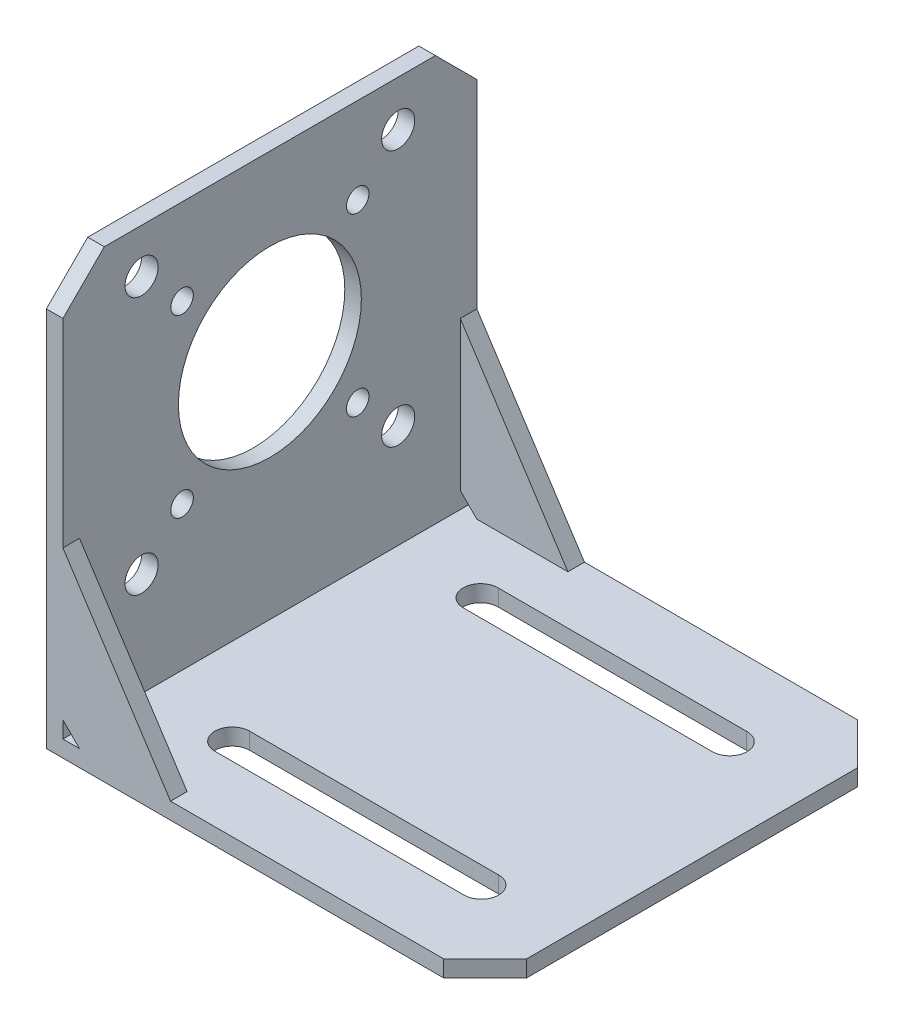
ISO-10303-21;
HEADER;
FILE_DESCRIPTION(('STEP AP214'),'2;1');
FILE_NAME('part.step','',(''),(''),'','','');
FILE_SCHEMA(('AUTOMOTIVE_DESIGN { 1 0 10303 214 1 1 1 1 }'));
ENDSEC;
DATA;
#1=APPLICATION_CONTEXT('core data for automotive mechanical design processes');
#2=APPLICATION_PROTOCOL_DEFINITION('international standard','automotive_design',2000,#1);
#3=PRODUCT_CONTEXT('',#1,'mechanical');
#4=PRODUCT('Part','Part','',(#3));
#5=PRODUCT_RELATED_PRODUCT_CATEGORY('part','',(#4));
#6=PRODUCT_DEFINITION_FORMATION('','',#4);
#7=PRODUCT_DEFINITION_CONTEXT('part definition',#1,'design');
#8=PRODUCT_DEFINITION('design','',#6,#7);
#9=PRODUCT_DEFINITION_SHAPE('','',#8);
#10=(LENGTH_UNIT() NAMED_UNIT(*) SI_UNIT(.MILLI.,.METRE.));
#11=(NAMED_UNIT(*) PLANE_ANGLE_UNIT() SI_UNIT($,.RADIAN.));
#12=(NAMED_UNIT(*) SI_UNIT($,.STERADIAN.) SOLID_ANGLE_UNIT());
#13=UNCERTAINTY_MEASURE_WITH_UNIT(LENGTH_MEASURE(1.E-05),#10,'distance_accuracy_value','');
#14=(GEOMETRIC_REPRESENTATION_CONTEXT(3) GLOBAL_UNCERTAINTY_ASSIGNED_CONTEXT((#13)) GLOBAL_UNIT_ASSIGNED_CONTEXT((#10,
#11,#12)) REPRESENTATION_CONTEXT('',''));
#15=CARTESIAN_POINT('',(0.,0.,0.));
#16=DIRECTION('',(0.,0.,1.));
#17=DIRECTION('',(1.,0.,0.));
#18=AXIS2_PLACEMENT_3D('',#15,#16,#17);
#19=CARTESIAN_POINT('',(53.,0.,50.));
#20=DIRECTION('',(0.,1.,0.));
#21=DIRECTION('',(-1.,0.,0.));
#22=AXIS2_PLACEMENT_3D('',#19,#20,#21);
#23=PLANE('',#22);
#24=DIRECTION('',(1.,0.,0.));
#25=VECTOR('',#24,1.);
#26=CARTESIAN_POINT('',(53.,0.,42.0995231668913));
#27=LINE('',#26,#25);
#28=CARTESIAN_POINT('',(12.5,0.,42.0995231668913));
#29=VERTEX_POINT('',#28);
#30=CARTESIAN_POINT('',(42.5,0.,42.0995231668913));
#31=VERTEX_POINT('',#30);
#32=EDGE_CURVE('E340',#29,#31,#27,.T.);
#33=ORIENTED_EDGE('',*,*,#32,.T.);
#34=CARTESIAN_POINT('',(42.5447489853135,0.,40.));
#35=DIRECTION('',(0.,1.,0.));
#36=DIRECTION('',(-1.,0.,0.));
#37=AXIS2_PLACEMENT_3D('',#34,#35,#36);
#38=CIRCLE('',#37,2.10000000000001);
#39=CARTESIAN_POINT('',(42.5447489853135,0.,37.9));
#40=VERTEX_POINT('',#39);
#41=EDGE_CURVE('E344',#31,#40,#38,.T.);
#42=ORIENTED_EDGE('',*,*,#41,.T.);
#43=DIRECTION('',(-1.,0.,0.));
#44=VECTOR('',#43,1.);
#45=CARTESIAN_POINT('',(53.,0.,37.9));
#46=LINE('',#45,#44);
#47=CARTESIAN_POINT('',(12.4552510146865,0.,37.9));
#48=VERTEX_POINT('',#47);
#49=EDGE_CURVE('E323',#40,#48,#46,.T.);
#50=ORIENTED_EDGE('',*,*,#49,.T.);
#51=CARTESIAN_POINT('',(12.4552510146873,0.,40.));
#52=DIRECTION('',(0.,1.,0.));
#53=DIRECTION('',(-1.,0.,0.));
#54=AXIS2_PLACEMENT_3D('',#51,#52,#53);
#55=CIRCLE('',#54,2.09999999999999);
#56=EDGE_CURVE('E336',#48,#29,#55,.T.);
#57=ORIENTED_EDGE('',*,*,#56,.T.);
#58=EDGE_LOOP('',(#33,#42,#50,#57));
#59=FACE_BOUND('',#58,.T.);
#60=DIRECTION('',(1.,0.,0.));
#61=VECTOR('',#60,1.);
#62=CARTESIAN_POINT('',(53.,0.,12.1));
#63=LINE('',#62,#61);
#64=CARTESIAN_POINT('',(12.4552510146865,0.,12.1));
#65=VERTEX_POINT('',#64);
#66=CARTESIAN_POINT('',(42.5447489853135,0.,12.1));
#67=VERTEX_POINT('',#66);
#68=EDGE_CURVE('E384',#65,#67,#63,.T.);
#69=ORIENTED_EDGE('',*,*,#68,.T.);
#70=CARTESIAN_POINT('',(42.5447489853135,0.,10.));
#71=DIRECTION('',(0.,1.,0.));
#72=DIRECTION('',(-1.,0.,0.));
#73=AXIS2_PLACEMENT_3D('',#70,#71,#72);
#74=CIRCLE('',#73,2.1);
#75=CARTESIAN_POINT('',(42.5,0.,7.90047683310867));
#76=VERTEX_POINT('',#75);
#77=EDGE_CURVE('E388',#67,#76,#74,.T.);
#78=ORIENTED_EDGE('',*,*,#77,.T.);
#79=DIRECTION('',(-1.,0.,0.));
#80=VECTOR('',#79,1.);
#81=CARTESIAN_POINT('',(53.,0.,7.90047683310866));
#82=LINE('',#81,#80);
#83=CARTESIAN_POINT('',(12.5,0.,7.90047683310867));
#84=VERTEX_POINT('',#83);
#85=EDGE_CURVE('E367',#76,#84,#82,.T.);
#86=ORIENTED_EDGE('',*,*,#85,.T.);
#87=CARTESIAN_POINT('',(12.4552510146861,0.,10.));
#88=DIRECTION('',(0.,1.,0.));
#89=DIRECTION('',(-1.,0.,0.));
#90=AXIS2_PLACEMENT_3D('',#87,#88,#89);
#91=CIRCLE('',#90,2.1);
#92=EDGE_CURVE('E380',#84,#65,#91,.T.);
#93=ORIENTED_EDGE('',*,*,#92,.T.);
#94=EDGE_LOOP('',(#69,#78,#86,#93));
#95=FACE_BOUND('',#94,.T.);
#96=DIRECTION('',(0.,0.,-1.));
#97=VECTOR('',#96,1.);
#98=CARTESIAN_POINT('',(53.,0.,50.));
#99=LINE('',#98,#97);
#100=CARTESIAN_POINT('',(53.,0.,45.));
#101=VERTEX_POINT('',#100);
#102=CARTESIAN_POINT('',(53.,0.,4.99999999999999));
#103=VERTEX_POINT('',#102);
#104=EDGE_CURVE('E476',#101,#103,#99,.T.);
#105=ORIENTED_EDGE('',*,*,#104,.F.);
#106=DIRECTION('',(0.707106781186547,0.,-0.707106781186549));
#107=VECTOR('',#106,1.);
#108=CARTESIAN_POINT('',(48.,0.,50.));
#109=LINE('',#108,#107);
#110=CARTESIAN_POINT('',(48.,0.,50.));
#111=VERTEX_POINT('',#110);
#112=EDGE_CURVE('E504',#101,#111,#109,.F.);
#113=ORIENTED_EDGE('',*,*,#112,.T.);
#114=DIRECTION('',(1.,0.,0.));
#115=VECTOR('',#114,1.);
#116=CARTESIAN_POINT('',(53.,0.,50.));
#117=LINE('',#116,#115);
#118=CARTESIAN_POINT('',(0.,0.,50.));
#119=VERTEX_POINT('',#118);
#120=EDGE_CURVE('E432',#119,#111,#117,.T.);
#121=ORIENTED_EDGE('',*,*,#120,.F.);
#122=DIRECTION('',(0.,0.,-1.));
#123=VECTOR('',#122,1.);
#124=CARTESIAN_POINT('',(0.,0.,50.));
#125=LINE('',#124,#123);
#126=CARTESIAN_POINT('',(0.,0.,0.));
#127=VERTEX_POINT('',#126);
#128=EDGE_CURVE('E449',#119,#127,#125,.T.);
#129=ORIENTED_EDGE('',*,*,#128,.T.);
#130=DIRECTION('',(1.,0.,0.));
#131=VECTOR('',#130,1.);
#132=CARTESIAN_POINT('',(53.,0.,0.));
#133=LINE('',#132,#131);
#134=CARTESIAN_POINT('',(48.,0.,0.));
#135=VERTEX_POINT('',#134);
#136=EDGE_CURVE('E225',#127,#135,#133,.T.);
#137=ORIENTED_EDGE('',*,*,#136,.T.);
#138=DIRECTION('',(0.707106781186549,0.,0.707106781186547));
#139=VECTOR('',#138,1.);
#140=CARTESIAN_POINT('',(53.,0.,4.99999999999999));
#141=LINE('',#140,#139);
#142=EDGE_CURVE('E501',#135,#103,#141,.T.);
#143=ORIENTED_EDGE('',*,*,#142,.T.);
#144=EDGE_LOOP('',(#105,#113,#121,#129,#137,#143));
#145=FACE_BOUND('',#144,.T.);
#146=ADVANCED_FACE('F39',(#59,#95,#145),#23,.F.);
#147=CARTESIAN_POINT('',(53.,2.,50.));
#148=DIRECTION('',(-1.,0.,0.));
#149=DIRECTION('',(0.,-1.,0.));
#150=AXIS2_PLACEMENT_3D('',#147,#148,#149);
#151=PLANE('',#150);
#152=DIRECTION('',(0.,0.,-1.));
#153=VECTOR('',#152,1.);
#154=CARTESIAN_POINT('',(53.,2.,50.));
#155=LINE('',#154,#153);
#156=CARTESIAN_POINT('',(53.,2.,45.));
#157=VERTEX_POINT('',#156);
#158=CARTESIAN_POINT('',(53.,2.,4.99999999999999));
#159=VERTEX_POINT('',#158);
#160=EDGE_CURVE('E472',#157,#159,#155,.T.);
#161=ORIENTED_EDGE('',*,*,#160,.F.);
#162=DIRECTION('',(0.,-1.,0.));
#163=VECTOR('',#162,1.);
#164=CARTESIAN_POINT('',(53.,2.,45.));
#165=LINE('',#164,#163);
#166=EDGE_CURVE('E498',#157,#101,#165,.T.);
#167=ORIENTED_EDGE('',*,*,#166,.T.);
#168=ORIENTED_EDGE('',*,*,#104,.T.);
#169=DIRECTION('',(0.,1.,0.));
#170=VECTOR('',#169,1.);
#171=CARTESIAN_POINT('',(53.,2.,4.99999999999999));
#172=LINE('',#171,#170);
#173=EDGE_CURVE('E494',#103,#159,#172,.T.);
#174=ORIENTED_EDGE('',*,*,#173,.T.);
#175=EDGE_LOOP('',(#161,#167,#168,#174));
#176=FACE_BOUND('',#175,.T.);
#177=ADVANCED_FACE('F618',(#176),#151,.F.);
#178=CARTESIAN_POINT('',(1.99999999999999,2.,50.));
#179=DIRECTION('',(0.,-1.,0.));
#180=DIRECTION('',(0.,0.,-1.));
#181=AXIS2_PLACEMENT_3D('',#178,#179,#180);
#182=PLANE('',#181);
#183=DIRECTION('',(-1.,0.,0.));
#184=VECTOR('',#183,1.);
#185=CARTESIAN_POINT('',(1.99999999999999,2.,50.));
#186=LINE('',#185,#184);
#187=CARTESIAN_POINT('',(48.,2.,50.));
#188=VERTEX_POINT('',#187);
#189=CARTESIAN_POINT('',(15.,2.,50.));
#190=VERTEX_POINT('',#189);
#191=EDGE_CURVE('E438',#188,#190,#186,.T.);
#192=ORIENTED_EDGE('',*,*,#191,.F.);
#193=DIRECTION('',(-0.707106781186547,0.,0.707106781186549));
#194=VECTOR('',#193,1.);
#195=CARTESIAN_POINT('',(48.,2.,50.));
#196=LINE('',#195,#194);
#197=EDGE_CURVE('E491',#188,#157,#196,.F.);
#198=ORIENTED_EDGE('',*,*,#197,.T.);
#199=ORIENTED_EDGE('',*,*,#160,.T.);
#200=DIRECTION('',(-0.707106781186549,0.,-0.707106781186547));
#201=VECTOR('',#200,1.);
#202=CARTESIAN_POINT('',(53.,2.,4.99999999999999));
#203=LINE('',#202,#201);
#204=CARTESIAN_POINT('',(48.,2.,0.));
#205=VERTEX_POINT('',#204);
#206=EDGE_CURVE('E488',#159,#205,#203,.T.);
#207=ORIENTED_EDGE('',*,*,#206,.T.);
#208=DIRECTION('',(-1.,0.,0.));
#209=VECTOR('',#208,1.);
#210=CARTESIAN_POINT('',(1.99999999999999,2.,0.));
#211=LINE('',#210,#209);
#212=CARTESIAN_POINT('',(15.,2.,0.));
#213=VERTEX_POINT('',#212);
#214=EDGE_CURVE('E224',#205,#213,#211,.T.);
#215=ORIENTED_EDGE('',*,*,#214,.T.);
#216=DIRECTION('',(0.,0.,-1.));
#217=VECTOR('',#216,1.);
#218=CARTESIAN_POINT('',(15.,2.,2.));
#219=LINE('',#218,#217);
#220=CARTESIAN_POINT('',(15.,2.,2.));
#221=VERTEX_POINT('',#220);
#222=EDGE_CURVE('E257',#221,#213,#219,.T.);
#223=ORIENTED_EDGE('',*,*,#222,.F.);
#224=DIRECTION('',(-1.,0.,0.));
#225=VECTOR('',#224,1.);
#226=CARTESIAN_POINT('',(15.,2.,2.));
#227=LINE('',#226,#225);
#228=CARTESIAN_POINT('',(3.99999999999999,2.,2.));
#229=VERTEX_POINT('',#228);
#230=EDGE_CURVE('E233',#221,#229,#227,.T.);
#231=ORIENTED_EDGE('',*,*,#230,.T.);
#232=DIRECTION('',(0.,0.,-1.));
#233=VECTOR('',#232,1.);
#234=CARTESIAN_POINT('',(3.99999999999999,2.,2.));
#235=LINE('',#234,#233);
#236=CARTESIAN_POINT('',(3.99999999999999,2.,0.));
#237=VERTEX_POINT('',#236);
#238=EDGE_CURVE('E228',#229,#237,#235,.T.);
#239=ORIENTED_EDGE('',*,*,#238,.T.);
#240=CARTESIAN_POINT('',(1.99999999999999,2.,0.));
#241=VERTEX_POINT('',#240);
#242=EDGE_CURVE('E213',#237,#241,#211,.T.);
#243=ORIENTED_EDGE('',*,*,#242,.T.);
#244=DIRECTION('',(0.,0.,-1.));
#245=VECTOR('',#244,1.);
#246=CARTESIAN_POINT('',(1.99999999999999,2.,50.));
#247=LINE('',#246,#245);
#248=CARTESIAN_POINT('',(1.99999999999999,2.,50.));
#249=VERTEX_POINT('',#248);
#250=EDGE_CURVE('E469',#249,#241,#247,.T.);
#251=ORIENTED_EDGE('',*,*,#250,.F.);
#252=CARTESIAN_POINT('',(3.99999999999999,2.,50.));
#253=VERTEX_POINT('',#252);
#254=EDGE_CURVE('E436',#253,#249,#186,.T.);
#255=ORIENTED_EDGE('',*,*,#254,.F.);
#256=DIRECTION('',(0.,0.,1.));
#257=VECTOR('',#256,1.);
#258=CARTESIAN_POINT('',(3.99999999999999,2.,48.));
#259=LINE('',#258,#257);
#260=CARTESIAN_POINT('',(3.99999999999999,2.,48.));
#261=VERTEX_POINT('',#260);
#262=EDGE_CURVE('E294',#261,#253,#259,.T.);
#263=ORIENTED_EDGE('',*,*,#262,.F.);
#264=DIRECTION('',(1.,0.,0.));
#265=VECTOR('',#264,1.);
#266=CARTESIAN_POINT('',(3.99999999999999,2.,48.));
#267=LINE('',#266,#265);
#268=CARTESIAN_POINT('',(15.,2.,48.));
#269=VERTEX_POINT('',#268);
#270=EDGE_CURVE('E280',#261,#269,#267,.T.);
#271=ORIENTED_EDGE('',*,*,#270,.T.);
#272=DIRECTION('',(0.,0.,1.));
#273=VECTOR('',#272,1.);
#274=CARTESIAN_POINT('',(15.,2.,48.));
#275=LINE('',#274,#273);
#276=EDGE_CURVE('E289',#269,#190,#275,.T.);
#277=ORIENTED_EDGE('',*,*,#276,.T.);
#278=EDGE_LOOP('',(#192,#198,#199,#207,#215,#223,#231,#239,#243,#251,#255,#263,#271,#277));
#279=FACE_BOUND('',#278,.T.);
#280=DIRECTION('',(-1.,0.,0.));
#281=VECTOR('',#280,1.);
#282=CARTESIAN_POINT('',(12.4552510146865,2.,37.9));
#283=LINE('',#282,#281);
#284=CARTESIAN_POINT('',(42.5447489853135,2.,37.9));
#285=VERTEX_POINT('',#284);
#286=CARTESIAN_POINT('',(12.4552510146865,2.,37.9));
#287=VERTEX_POINT('',#286);
#288=EDGE_CURVE('E307',#285,#287,#283,.T.);
#289=ORIENTED_EDGE('',*,*,#288,.F.);
#290=CARTESIAN_POINT('',(42.5447489853135,2.,40.));
#291=DIRECTION('',(0.,1.,0.));
#292=DIRECTION('',(0.,0.,-1.));
#293=AXIS2_PLACEMENT_3D('',#290,#291,#292);
#294=CIRCLE('',#293,2.10000000000001);
#295=CARTESIAN_POINT('',(42.5,2.,42.0995231668913));
#296=VERTEX_POINT('',#295);
#297=EDGE_CURVE('E293',#296,#285,#294,.T.);
#298=ORIENTED_EDGE('',*,*,#297,.F.);
#299=DIRECTION('',(1.,0.,0.));
#300=VECTOR('',#299,1.);
#301=CARTESIAN_POINT('',(12.5,2.,42.0995231668913));
#302=LINE('',#301,#300);
#303=CARTESIAN_POINT('',(12.5,2.,42.0995231668913));
#304=VERTEX_POINT('',#303);
#305=EDGE_CURVE('E315',#304,#296,#302,.T.);
#306=ORIENTED_EDGE('',*,*,#305,.F.);
#307=CARTESIAN_POINT('',(12.4552510146873,2.,40.));
#308=DIRECTION('',(0.,1.,0.));
#309=DIRECTION('',(0.,0.,-1.));
#310=AXIS2_PLACEMENT_3D('',#307,#308,#309);
#311=CIRCLE('',#310,2.09999999999999);
#312=EDGE_CURVE('E311',#287,#304,#311,.T.);
#313=ORIENTED_EDGE('',*,*,#312,.F.);
#314=EDGE_LOOP('',(#289,#298,#306,#313));
#315=FACE_BOUND('',#314,.T.);
#316=DIRECTION('',(-1.,0.,0.));
#317=VECTOR('',#316,1.);
#318=CARTESIAN_POINT('',(12.5,2.,7.90047683310867));
#319=LINE('',#318,#317);
#320=CARTESIAN_POINT('',(42.5,2.,7.90047683310866));
#321=VERTEX_POINT('',#320);
#322=CARTESIAN_POINT('',(12.5,2.,7.90047683310867));
#323=VERTEX_POINT('',#322);
#324=EDGE_CURVE('E351',#321,#323,#319,.T.);
#325=ORIENTED_EDGE('',*,*,#324,.F.);
#326=CARTESIAN_POINT('',(42.5447489853135,2.,10.));
#327=DIRECTION('',(0.,1.,0.));
#328=DIRECTION('',(0.,0.,-1.));
#329=AXIS2_PLACEMENT_3D('',#326,#327,#328);
#330=CIRCLE('',#329,2.1);
#331=CARTESIAN_POINT('',(42.5447489853135,2.,12.1));
#332=VERTEX_POINT('',#331);
#333=EDGE_CURVE('E348',#332,#321,#330,.T.);
#334=ORIENTED_EDGE('',*,*,#333,.F.);
#335=DIRECTION('',(1.,0.,0.));
#336=VECTOR('',#335,1.);
#337=CARTESIAN_POINT('',(12.4552510146865,2.,12.1));
#338=LINE('',#337,#336);
#339=CARTESIAN_POINT('',(12.4552510146865,2.,12.1));
#340=VERTEX_POINT('',#339);
#341=EDGE_CURVE('E359',#340,#332,#338,.T.);
#342=ORIENTED_EDGE('',*,*,#341,.F.);
#343=CARTESIAN_POINT('',(12.4552510146861,2.,10.));
#344=DIRECTION('',(0.,1.,0.));
#345=DIRECTION('',(0.,0.,-1.));
#346=AXIS2_PLACEMENT_3D('',#343,#344,#345);
#347=CIRCLE('',#346,2.1);
#348=EDGE_CURVE('E355',#323,#340,#347,.T.);
#349=ORIENTED_EDGE('',*,*,#348,.F.);
#350=EDGE_LOOP('',(#325,#334,#342,#349));
#351=FACE_BOUND('',#350,.T.);
#352=ADVANCED_FACE('F230',(#279,#315,#351),#182,.F.);
#353=CARTESIAN_POINT('',(1.99999999999999,51.,50.));
#354=DIRECTION('',(-1.,0.,0.));
#355=DIRECTION('',(0.,-1.,0.));
#356=AXIS2_PLACEMENT_3D('',#353,#354,#355);
#357=PLANE('',#356);
#358=CARTESIAN_POINT('',(1.99999999999999,40.6066017177981,35.6066017177983));
#359=DIRECTION('',(-1.,0.,0.));
#360=DIRECTION('',(0.,-1.,0.));
#361=AXIS2_PLACEMENT_3D('',#358,#359,#360);
#362=CIRCLE('',#361,1.36115340044237);
#363=CARTESIAN_POINT('',(1.99999999999999,39.2454483173557,35.6066017177983));
#364=VERTEX_POINT('',#363);
#365=EDGE_CURVE('E245',#364,#364,#362,.T.);
#366=ORIENTED_EDGE('',*,*,#365,.T.);
#367=EDGE_LOOP('',(#366));
#368=FACE_BOUND('',#367,.T.);
#369=CARTESIAN_POINT('',(1.99999999999999,40.6066017177983,14.3933982822019));
#370=DIRECTION('',(-1.,0.,0.));
#371=DIRECTION('',(0.,-1.,0.));
#372=AXIS2_PLACEMENT_3D('',#369,#370,#371);
#373=CIRCLE('',#372,1.36115340044236);
#374=CARTESIAN_POINT('',(1.99999999999999,39.2454483173559,14.3933982822019));
#375=VERTEX_POINT('',#374);
#376=EDGE_CURVE('E252',#375,#375,#373,.T.);
#377=ORIENTED_EDGE('',*,*,#376,.T.);
#378=EDGE_LOOP('',(#377));
#379=FACE_BOUND('',#378,.T.);
#380=CARTESIAN_POINT('',(1.99999999999999,19.3933982822018,14.3933982822017));
#381=DIRECTION('',(-1.,0.,0.));
#382=DIRECTION('',(0.,-1.,0.));
#383=AXIS2_PLACEMENT_3D('',#380,#381,#382);
#384=CIRCLE('',#383,1.36115340044237);
#385=CARTESIAN_POINT('',(1.99999999999999,18.0322448817595,14.3933982822017));
#386=VERTEX_POINT('',#385);
#387=EDGE_CURVE('E542',#386,#386,#384,.T.);
#388=ORIENTED_EDGE('',*,*,#387,.T.);
#389=EDGE_LOOP('',(#388));
#390=FACE_BOUND('',#389,.T.);
#391=CARTESIAN_POINT('',(1.99999999999999,19.3933982822018,35.6066017177982));
#392=DIRECTION('',(-1.,0.,0.));
#393=DIRECTION('',(0.,-1.,0.));
#394=AXIS2_PLACEMENT_3D('',#391,#392,#393);
#395=CIRCLE('',#394,1.36115340044237);
#396=CARTESIAN_POINT('',(1.99999999999999,18.0322448817594,35.6066017177982));
#397=VERTEX_POINT('',#396);
#398=EDGE_CURVE('E546',#397,#397,#395,.T.);
#399=ORIENTED_EDGE('',*,*,#398,.T.);
#400=EDGE_LOOP('',(#399));
#401=FACE_BOUND('',#400,.T.);
#402=DIRECTION('',(0.,0.,-1.));
#403=VECTOR('',#402,1.);
#404=CARTESIAN_POINT('',(1.99999999999999,51.,50.));
#405=LINE('',#404,#403);
#406=CARTESIAN_POINT('',(1.99999999999999,51.,45.));
#407=VERTEX_POINT('',#406);
#408=CARTESIAN_POINT('',(1.99999999999999,51.,4.99999999999999));
#409=VERTEX_POINT('',#408);
#410=EDGE_CURVE('E466',#407,#409,#405,.T.);
#411=ORIENTED_EDGE('',*,*,#410,.F.);
#412=DIRECTION('',(0.,0.707106781186547,-0.707106781186549));
#413=VECTOR('',#412,1.);
#414=CARTESIAN_POINT('',(1.99999999999999,46.,50.));
#415=LINE('',#414,#413);
#416=CARTESIAN_POINT('',(1.99999999999999,46.,50.));
#417=VERTEX_POINT('',#416);
#418=EDGE_CURVE('E11',#407,#417,#415,.F.);
#419=ORIENTED_EDGE('',*,*,#418,.T.);
#420=DIRECTION('',(0.,1.,0.));
#421=VECTOR('',#420,1.);
#422=CARTESIAN_POINT('',(1.99999999999999,51.,50.));
#423=LINE('',#422,#421);
#424=CARTESIAN_POINT('',(1.99999999999999,22.,50.));
#425=VERTEX_POINT('',#424);
#426=EDGE_CURVE('E441',#425,#417,#423,.T.);
#427=ORIENTED_EDGE('',*,*,#426,.F.);
#428=DIRECTION('',(0.,0.,1.));
#429=VECTOR('',#428,1.);
#430=CARTESIAN_POINT('',(1.99999999999999,22.,48.));
#431=LINE('',#430,#429);
#432=CARTESIAN_POINT('',(1.99999999999999,22.,48.));
#433=VERTEX_POINT('',#432);
#434=EDGE_CURVE('E284',#433,#425,#431,.T.);
#435=ORIENTED_EDGE('',*,*,#434,.F.);
#436=DIRECTION('',(0.,-1.,0.));
#437=VECTOR('',#436,1.);
#438=CARTESIAN_POINT('',(1.99999999999999,22.,48.));
#439=LINE('',#438,#437);
#440=CARTESIAN_POINT('',(2.,4.,48.));
#441=VERTEX_POINT('',#440);
#442=EDGE_CURVE('E272',#433,#441,#439,.T.);
#443=ORIENTED_EDGE('',*,*,#442,.T.);
#444=DIRECTION('',(0.,0.,1.));
#445=VECTOR('',#444,1.);
#446=CARTESIAN_POINT('',(2.,4.,48.));
#447=LINE('',#446,#445);
#448=CARTESIAN_POINT('',(2.,4.,50.));
#449=VERTEX_POINT('',#448);
#450=EDGE_CURVE('E298',#441,#449,#447,.T.);
#451=ORIENTED_EDGE('',*,*,#450,.T.);
#452=EDGE_CURVE('E442',#249,#449,#423,.T.);
#453=ORIENTED_EDGE('',*,*,#452,.F.);
#454=ORIENTED_EDGE('',*,*,#250,.T.);
#455=DIRECTION('',(0.,1.,0.));
#456=VECTOR('',#455,1.);
#457=CARTESIAN_POINT('',(1.99999999999999,51.,0.));
#458=LINE('',#457,#456);
#459=CARTESIAN_POINT('',(1.99999999999999,4.00000000000001,0.));
#460=VERTEX_POINT('',#459);
#461=EDGE_CURVE('E219',#241,#460,#458,.T.);
#462=ORIENTED_EDGE('',*,*,#461,.T.);
#463=DIRECTION('',(0.,0.,-1.));
#464=VECTOR('',#463,1.);
#465=CARTESIAN_POINT('',(1.99999999999999,4.,2.));
#466=LINE('',#465,#464);
#467=CARTESIAN_POINT('',(1.99999999999999,4.,2.));
#468=VERTEX_POINT('',#467);
#469=EDGE_CURVE('E238',#468,#460,#466,.T.);
#470=ORIENTED_EDGE('',*,*,#469,.F.);
#471=DIRECTION('',(0.,1.,0.));
#472=VECTOR('',#471,1.);
#473=CARTESIAN_POINT('',(1.99999999999999,4.,2.));
#474=LINE('',#473,#472);
#475=CARTESIAN_POINT('',(1.99999999999999,22.,2.));
#476=VERTEX_POINT('',#475);
#477=EDGE_CURVE('E532',#468,#476,#474,.T.);
#478=ORIENTED_EDGE('',*,*,#477,.T.);
#479=DIRECTION('',(0.,0.,-1.));
#480=VECTOR('',#479,1.);
#481=CARTESIAN_POINT('',(1.99999999999999,22.,2.));
#482=LINE('',#481,#480);
#483=CARTESIAN_POINT('',(1.99999999999999,22.,0.));
#484=VERTEX_POINT('',#483);
#485=EDGE_CURVE('E262',#476,#484,#482,.T.);
#486=ORIENTED_EDGE('',*,*,#485,.T.);
#487=CARTESIAN_POINT('',(1.99999999999999,46.,0.));
#488=VERTEX_POINT('',#487);
#489=EDGE_CURVE('E454',#484,#488,#458,.T.);
#490=ORIENTED_EDGE('',*,*,#489,.T.);
#491=DIRECTION('',(0.,0.707106781186549,0.707106781186547));
#492=VECTOR('',#491,1.);
#493=CARTESIAN_POINT('',(1.99999999999999,51.,4.99999999999999));
#494=LINE('',#493,#492);
#495=EDGE_CURVE('E48',#488,#409,#494,.T.);
#496=ORIENTED_EDGE('',*,*,#495,.T.);
#497=EDGE_LOOP('',(#411,#419,#427,#435,#443,#451,#453,#454,#462,#470,#478,#486,#490,#496));
#498=FACE_BOUND('',#497,.T.);
#499=CARTESIAN_POINT('',(1.99999999999999,45.6404459869094,40.5));
#500=DIRECTION('',(1.,0.,0.));
#501=DIRECTION('',(0.,1.,0.));
#502=AXIS2_PLACEMENT_3D('',#499,#500,#501);
#503=CIRCLE('',#502,2.);
#504=CARTESIAN_POINT('',(1.99999999999999,47.6404459869094,40.5));
#505=VERTEX_POINT('',#504);
#506=EDGE_CURVE('E398',#505,#505,#503,.T.);
#507=ORIENTED_EDGE('',*,*,#506,.F.);
#508=EDGE_LOOP('',(#507));
#509=FACE_BOUND('',#508,.T.);
#510=CARTESIAN_POINT('',(1.99999999999999,45.5,9.50000000000001));
#511=DIRECTION('',(1.,0.,0.));
#512=DIRECTION('',(0.,1.,0.));
#513=AXIS2_PLACEMENT_3D('',#510,#511,#512);
#514=CIRCLE('',#513,2.);
#515=CARTESIAN_POINT('',(1.99999999999999,47.5,9.50000000000001));
#516=VERTEX_POINT('',#515);
#517=EDGE_CURVE('E406',#516,#516,#514,.T.);
#518=ORIENTED_EDGE('',*,*,#517,.F.);
#519=EDGE_LOOP('',(#518));
#520=FACE_BOUND('',#519,.T.);
#521=CARTESIAN_POINT('',(1.99999999999999,14.5,40.5));
#522=DIRECTION('',(1.,0.,0.));
#523=DIRECTION('',(0.,1.,0.));
#524=AXIS2_PLACEMENT_3D('',#521,#522,#523);
#525=CIRCLE('',#524,2.);
#526=CARTESIAN_POINT('',(1.99999999999999,16.5,40.5));
#527=VERTEX_POINT('',#526);
#528=EDGE_CURVE('E414',#527,#527,#525,.T.);
#529=ORIENTED_EDGE('',*,*,#528,.F.);
#530=EDGE_LOOP('',(#529));
#531=FACE_BOUND('',#530,.T.);
#532=CARTESIAN_POINT('',(1.99999999999999,14.5,9.5));
#533=DIRECTION('',(1.,0.,0.));
#534=DIRECTION('',(0.,1.,0.));
#535=AXIS2_PLACEMENT_3D('',#532,#533,#534);
#536=CIRCLE('',#535,2.);
#537=CARTESIAN_POINT('',(1.99999999999999,16.5,9.5));
#538=VERTEX_POINT('',#537);
#539=EDGE_CURVE('E392',#538,#538,#536,.T.);
#540=ORIENTED_EDGE('',*,*,#539,.F.);
#541=EDGE_LOOP('',(#540));
#542=FACE_BOUND('',#541,.T.);
#543=CARTESIAN_POINT('',(1.99999999999999,30.,25.));
#544=DIRECTION('',(1.,0.,0.));
#545=DIRECTION('',(0.,1.,0.));
#546=AXIS2_PLACEMENT_3D('',#543,#544,#545);
#547=CIRCLE('',#546,11.05);
#548=CARTESIAN_POINT('',(1.99999999999999,41.05,25.));
#549=VERTEX_POINT('',#548);
#550=EDGE_CURVE('E397',#549,#549,#547,.T.);
#551=ORIENTED_EDGE('',*,*,#550,.F.);
#552=EDGE_LOOP('',(#551));
#553=FACE_BOUND('',#552,.T.);
#554=ADVANCED_FACE('F600',(#368,#379,#390,#401,#498,#509,#520,#531,#542,#553),#357,.F.);
#555=CARTESIAN_POINT('',(0.,51.,50.));
#556=DIRECTION('',(0.,-1.,0.));
#557=DIRECTION('',(0.,0.,-1.));
#558=AXIS2_PLACEMENT_3D('',#555,#556,#557);
#559=PLANE('',#558);
#560=DIRECTION('',(0.,0.,-1.));
#561=VECTOR('',#560,1.);
#562=CARTESIAN_POINT('',(0.,51.,50.));
#563=LINE('',#562,#561);
#564=CARTESIAN_POINT('',(0.,51.,45.));
#565=VERTEX_POINT('',#564);
#566=CARTESIAN_POINT('',(0.,51.,4.99999999999999));
#567=VERTEX_POINT('',#566);
#568=EDGE_CURVE('E462',#565,#567,#563,.T.);
#569=ORIENTED_EDGE('',*,*,#568,.F.);
#570=DIRECTION('',(1.,0.,0.));
#571=VECTOR('',#570,1.);
#572=CARTESIAN_POINT('',(0.,51.,45.));
#573=LINE('',#572,#571);
#574=EDGE_CURVE('E61',#565,#407,#573,.T.);
#575=ORIENTED_EDGE('',*,*,#574,.T.);
#576=ORIENTED_EDGE('',*,*,#410,.T.);
#577=DIRECTION('',(-1.,0.,0.));
#578=VECTOR('',#577,1.);
#579=CARTESIAN_POINT('',(0.,51.,4.99999999999999));
#580=LINE('',#579,#578);
#581=EDGE_CURVE('E519',#409,#567,#580,.T.);
#582=ORIENTED_EDGE('',*,*,#581,.T.);
#583=EDGE_LOOP('',(#569,#575,#576,#582));
#584=FACE_BOUND('',#583,.T.);
#585=ADVANCED_FACE('F574',(#584),#559,.F.);
#586=CARTESIAN_POINT('',(0.,0.,50.));
#587=DIRECTION('',(1.,0.,0.));
#588=DIRECTION('',(0.,1.,0.));
#589=AXIS2_PLACEMENT_3D('',#586,#587,#588);
#590=PLANE('',#589);
#591=CARTESIAN_POINT('',(0.,40.6066017177981,35.6066017177983));
#592=DIRECTION('',(-1.,0.,0.));
#593=DIRECTION('',(0.,-1.,0.));
#594=AXIS2_PLACEMENT_3D('',#591,#592,#593);
#595=CIRCLE('',#594,1.36115340044237);
#596=CARTESIAN_POINT('',(0.,39.2454483173557,35.6066017177983));
#597=VERTEX_POINT('',#596);
#598=EDGE_CURVE('E555',#597,#597,#595,.T.);
#599=ORIENTED_EDGE('',*,*,#598,.F.);
#600=EDGE_LOOP('',(#599));
#601=FACE_BOUND('',#600,.T.);
#602=CARTESIAN_POINT('',(0.,40.6066017177983,14.3933982822019));
#603=DIRECTION('',(-1.,0.,0.));
#604=DIRECTION('',(0.,-1.,0.));
#605=AXIS2_PLACEMENT_3D('',#602,#603,#604);
#606=CIRCLE('',#605,1.36115340044236);
#607=CARTESIAN_POINT('',(0.,39.2454483173559,14.3933982822019));
#608=VERTEX_POINT('',#607);
#609=EDGE_CURVE('E559',#608,#608,#606,.T.);
#610=ORIENTED_EDGE('',*,*,#609,.F.);
#611=EDGE_LOOP('',(#610));
#612=FACE_BOUND('',#611,.T.);
#613=CARTESIAN_POINT('',(0.,19.3933982822018,14.3933982822017));
#614=DIRECTION('',(-1.,0.,0.));
#615=DIRECTION('',(0.,-1.,0.));
#616=AXIS2_PLACEMENT_3D('',#613,#614,#615);
#617=CIRCLE('',#616,1.36115340044237);
#618=CARTESIAN_POINT('',(0.,18.0322448817595,14.3933982822017));
#619=VERTEX_POINT('',#618);
#620=EDGE_CURVE('E554',#619,#619,#617,.T.);
#621=ORIENTED_EDGE('',*,*,#620,.F.);
#622=EDGE_LOOP('',(#621));
#623=FACE_BOUND('',#622,.T.);
#624=CARTESIAN_POINT('',(0.,19.3933982822018,35.6066017177982));
#625=DIRECTION('',(-1.,0.,0.));
#626=DIRECTION('',(0.,-1.,0.));
#627=AXIS2_PLACEMENT_3D('',#624,#625,#626);
#628=CIRCLE('',#627,1.36115340044237);
#629=CARTESIAN_POINT('',(0.,18.0322448817594,35.6066017177982));
#630=VERTEX_POINT('',#629);
#631=EDGE_CURVE('E550',#630,#630,#628,.T.);
#632=ORIENTED_EDGE('',*,*,#631,.F.);
#633=EDGE_LOOP('',(#632));
#634=FACE_BOUND('',#633,.T.);
#635=CARTESIAN_POINT('',(0.,45.6404459869094,40.5));
#636=DIRECTION('',(1.,0.,0.));
#637=DIRECTION('',(0.,1.,0.));
#638=AXIS2_PLACEMENT_3D('',#635,#636,#637);
#639=CIRCLE('',#638,2.);
#640=CARTESIAN_POINT('',(0.,47.6404459869094,40.5));
#641=VERTEX_POINT('',#640);
#642=EDGE_CURVE('E393',#641,#641,#639,.T.);
#643=ORIENTED_EDGE('',*,*,#642,.T.);
#644=EDGE_LOOP('',(#643));
#645=FACE_BOUND('',#644,.T.);
#646=CARTESIAN_POINT('',(0.,45.5,9.50000000000001));
#647=DIRECTION('',(1.,0.,0.));
#648=DIRECTION('',(0.,1.,0.));
#649=AXIS2_PLACEMENT_3D('',#646,#647,#648);
#650=CIRCLE('',#649,2.);
#651=CARTESIAN_POINT('',(0.,47.5,9.50000000000001));
#652=VERTEX_POINT('',#651);
#653=EDGE_CURVE('E402',#652,#652,#650,.T.);
#654=ORIENTED_EDGE('',*,*,#653,.T.);
#655=EDGE_LOOP('',(#654));
#656=FACE_BOUND('',#655,.T.);
#657=CARTESIAN_POINT('',(0.,14.5,40.5));
#658=DIRECTION('',(1.,0.,0.));
#659=DIRECTION('',(0.,1.,0.));
#660=AXIS2_PLACEMENT_3D('',#657,#658,#659);
#661=CIRCLE('',#660,2.);
#662=CARTESIAN_POINT('',(0.,16.5,40.5));
#663=VERTEX_POINT('',#662);
#664=EDGE_CURVE('E410',#663,#663,#661,.T.);
#665=ORIENTED_EDGE('',*,*,#664,.T.);
#666=EDGE_LOOP('',(#665));
#667=FACE_BOUND('',#666,.T.);
#668=CARTESIAN_POINT('',(0.,14.5,9.5));
#669=DIRECTION('',(1.,0.,0.));
#670=DIRECTION('',(0.,1.,0.));
#671=AXIS2_PLACEMENT_3D('',#668,#669,#670);
#672=CIRCLE('',#671,2.);
#673=CARTESIAN_POINT('',(0.,16.5,9.5));
#674=VERTEX_POINT('',#673);
#675=EDGE_CURVE('E418',#674,#674,#672,.T.);
#676=ORIENTED_EDGE('',*,*,#675,.T.);
#677=EDGE_LOOP('',(#676));
#678=FACE_BOUND('',#677,.T.);
#679=CARTESIAN_POINT('',(0.,30.,25.));
#680=DIRECTION('',(1.,0.,0.));
#681=DIRECTION('',(0.,1.,0.));
#682=AXIS2_PLACEMENT_3D('',#679,#680,#681);
#683=CIRCLE('',#682,11.05);
#684=CARTESIAN_POINT('',(0.,41.05,25.));
#685=VERTEX_POINT('',#684);
#686=EDGE_CURVE('E425',#685,#685,#683,.T.);
#687=ORIENTED_EDGE('',*,*,#686,.T.);
#688=EDGE_LOOP('',(#687));
#689=FACE_BOUND('',#688,.T.);
#690=DIRECTION('',(0.,-1.,0.));
#691=VECTOR('',#690,1.);
#692=CARTESIAN_POINT('',(0.,0.,50.));
#693=LINE('',#692,#691);
#694=CARTESIAN_POINT('',(0.,46.,50.));
#695=VERTEX_POINT('',#694);
#696=EDGE_CURVE('E446',#695,#119,#693,.T.);
#697=ORIENTED_EDGE('',*,*,#696,.F.);
#698=DIRECTION('',(0.,-0.707106781186547,0.707106781186549));
#699=VECTOR('',#698,1.);
#700=CARTESIAN_POINT('',(0.,46.,50.));
#701=LINE('',#700,#699);
#702=EDGE_CURVE('E516',#695,#565,#701,.F.);
#703=ORIENTED_EDGE('',*,*,#702,.T.);
#704=ORIENTED_EDGE('',*,*,#568,.T.);
#705=DIRECTION('',(0.,-0.707106781186549,-0.707106781186547));
#706=VECTOR('',#705,1.);
#707=CARTESIAN_POINT('',(0.,51.,4.99999999999999));
#708=LINE('',#707,#706);
#709=CARTESIAN_POINT('',(0.,46.,0.));
#710=VERTEX_POINT('',#709);
#711=EDGE_CURVE('E513',#567,#710,#708,.T.);
#712=ORIENTED_EDGE('',*,*,#711,.T.);
#713=DIRECTION('',(0.,-1.,0.));
#714=VECTOR('',#713,1.);
#715=CARTESIAN_POINT('',(0.,0.,0.));
#716=LINE('',#715,#714);
#717=EDGE_CURVE('E437',#710,#127,#716,.T.);
#718=ORIENTED_EDGE('',*,*,#717,.T.);
#719=ORIENTED_EDGE('',*,*,#128,.F.);
#720=EDGE_LOOP('',(#697,#703,#704,#712,#718,#719));
#721=FACE_BOUND('',#720,.T.);
#722=ADVANCED_FACE('F570',(#601,#612,#623,#634,#645,#656,#667,#678,#689,#721),#590,.F.);
#723=CARTESIAN_POINT('',(0.,0.,50.));
#724=DIRECTION('',(0.,0.,-1.));
#725=DIRECTION('',(-1.,0.,0.));
#726=AXIS2_PLACEMENT_3D('',#723,#724,#725);
#727=PLANE('',#726);
#728=ORIENTED_EDGE('',*,*,#120,.T.);
#729=DIRECTION('',(0.,1.,0.));
#730=VECTOR('',#729,1.);
#731=CARTESIAN_POINT('',(48.,1.66533453693774E-13,50.));
#732=LINE('',#731,#730);
#733=EDGE_CURVE('E484',#111,#188,#732,.T.);
#734=ORIENTED_EDGE('',*,*,#733,.T.);
#735=ORIENTED_EDGE('',*,*,#191,.T.);
#736=DIRECTION('',(-0.544988350595414,0.838443616300637,0.));
#737=VECTOR('',#736,1.);
#738=CARTESIAN_POINT('',(15.,2.,50.));
#739=LINE('',#738,#737);
#740=EDGE_CURVE('E261',#190,#425,#739,.T.);
#741=ORIENTED_EDGE('',*,*,#740,.T.);
#742=ORIENTED_EDGE('',*,*,#426,.T.);
#743=DIRECTION('',(-1.,0.,0.));
#744=VECTOR('',#743,1.);
#745=CARTESIAN_POINT('',(0.,46.,50.));
#746=LINE('',#745,#744);
#747=EDGE_CURVE('E480',#417,#695,#746,.T.);
#748=ORIENTED_EDGE('',*,*,#747,.T.);
#749=ORIENTED_EDGE('',*,*,#696,.T.);
#750=EDGE_LOOP('',(#728,#734,#735,#741,#742,#748,#749));
#751=FACE_BOUND('',#750,.T.);
#752=DIRECTION('',(0.707106781186547,-0.707106781186548,0.));
#753=VECTOR('',#752,1.);
#754=CARTESIAN_POINT('',(2.,4.,50.));
#755=LINE('',#754,#753);
#756=EDGE_CURVE('E273',#449,#253,#755,.T.);
#757=ORIENTED_EDGE('',*,*,#756,.T.);
#758=ORIENTED_EDGE('',*,*,#254,.T.);
#759=ORIENTED_EDGE('',*,*,#452,.T.);
#760=EDGE_LOOP('',(#757,#758,#759));
#761=FACE_BOUND('',#760,.T.);
#762=ADVANCED_FACE('F573',(#751,#761),#727,.F.);
#763=CARTESIAN_POINT('',(0.,0.,0.));
#764=DIRECTION('',(0.,0.,-1.));
#765=DIRECTION('',(-1.,0.,0.));
#766=AXIS2_PLACEMENT_3D('',#763,#764,#765);
#767=PLANE('',#766);
#768=ORIENTED_EDGE('',*,*,#242,.F.);
#769=DIRECTION('',(-0.707106781186548,0.707106781186547,0.));
#770=VECTOR('',#769,1.);
#771=CARTESIAN_POINT('',(3.99999999999999,2.,0.));
#772=LINE('',#771,#770);
#773=EDGE_CURVE('E218',#237,#460,#772,.T.);
#774=ORIENTED_EDGE('',*,*,#773,.T.);
#775=ORIENTED_EDGE('',*,*,#461,.F.);
#776=EDGE_LOOP('',(#768,#774,#775));
#777=FACE_BOUND('',#776,.T.);
#778=ORIENTED_EDGE('',*,*,#214,.F.);
#779=DIRECTION('',(0.,-1.,0.));
#780=VECTOR('',#779,1.);
#781=CARTESIAN_POINT('',(48.,0.,0.));
#782=LINE('',#781,#780);
#783=EDGE_CURVE('E510',#205,#135,#782,.T.);
#784=ORIENTED_EDGE('',*,*,#783,.T.);
#785=ORIENTED_EDGE('',*,*,#136,.F.);
#786=ORIENTED_EDGE('',*,*,#717,.F.);
#787=DIRECTION('',(1.,0.,0.));
#788=VECTOR('',#787,1.);
#789=CARTESIAN_POINT('',(1.99999999999999,46.,0.));
#790=LINE('',#789,#788);
#791=EDGE_CURVE('E507',#710,#488,#790,.T.);
#792=ORIENTED_EDGE('',*,*,#791,.T.);
#793=ORIENTED_EDGE('',*,*,#489,.F.);
#794=DIRECTION('',(0.544988350595414,-0.838443616300637,0.));
#795=VECTOR('',#794,1.);
#796=CARTESIAN_POINT('',(1.99999999999999,22.,0.));
#797=LINE('',#796,#795);
#798=EDGE_CURVE('E244',#484,#213,#797,.T.);
#799=ORIENTED_EDGE('',*,*,#798,.T.);
#800=EDGE_LOOP('',(#778,#784,#785,#786,#792,#793,#799));
#801=FACE_BOUND('',#800,.T.);
#802=ADVANCED_FACE('F215',(#777,#801),#767,.T.);
#803=CARTESIAN_POINT('',(0.,30.,25.));
#804=DIRECTION('',(1.,0.,0.));
#805=DIRECTION('',(0.,1.,0.));
#806=AXIS2_PLACEMENT_3D('',#803,#804,#805);
#807=CYLINDRICAL_SURFACE('',#806,11.05);
#808=ORIENTED_EDGE('',*,*,#686,.F.);
#809=EDGE_LOOP('',(#808));
#810=FACE_BOUND('',#809,.T.);
#811=ORIENTED_EDGE('',*,*,#550,.T.);
#812=EDGE_LOOP('',(#811));
#813=FACE_BOUND('',#812,.T.);
#814=ADVANCED_FACE('F777',(#810,#813),#807,.F.);
#815=CARTESIAN_POINT('',(0.,14.5,9.5));
#816=DIRECTION('',(1.,0.,0.));
#817=DIRECTION('',(0.,1.,0.));
#818=AXIS2_PLACEMENT_3D('',#815,#816,#817);
#819=CYLINDRICAL_SURFACE('',#818,2.);
#820=ORIENTED_EDGE('',*,*,#675,.F.);
#821=EDGE_LOOP('',(#820));
#822=FACE_BOUND('',#821,.T.);
#823=ORIENTED_EDGE('',*,*,#539,.T.);
#824=EDGE_LOOP('',(#823));
#825=FACE_BOUND('',#824,.T.);
#826=ADVANCED_FACE('F784',(#822,#825),#819,.F.);
#827=CARTESIAN_POINT('',(0.,14.5,40.5));
#828=DIRECTION('',(1.,0.,0.));
#829=DIRECTION('',(0.,1.,0.));
#830=AXIS2_PLACEMENT_3D('',#827,#828,#829);
#831=CYLINDRICAL_SURFACE('',#830,2.);
#832=ORIENTED_EDGE('',*,*,#664,.F.);
#833=EDGE_LOOP('',(#832));
#834=FACE_BOUND('',#833,.T.);
#835=ORIENTED_EDGE('',*,*,#528,.T.);
#836=EDGE_LOOP('',(#835));
#837=FACE_BOUND('',#836,.T.);
#838=ADVANCED_FACE('F792',(#834,#837),#831,.F.);
#839=CARTESIAN_POINT('',(0.,45.5,9.50000000000001));
#840=DIRECTION('',(1.,0.,0.));
#841=DIRECTION('',(0.,1.,0.));
#842=AXIS2_PLACEMENT_3D('',#839,#840,#841);
#843=CYLINDRICAL_SURFACE('',#842,2.);
#844=ORIENTED_EDGE('',*,*,#653,.F.);
#845=EDGE_LOOP('',(#844));
#846=FACE_BOUND('',#845,.T.);
#847=ORIENTED_EDGE('',*,*,#517,.T.);
#848=EDGE_LOOP('',(#847));
#849=FACE_BOUND('',#848,.T.);
#850=ADVANCED_FACE('F800',(#846,#849),#843,.F.);
#851=CARTESIAN_POINT('',(0.,45.6404459869094,40.5));
#852=DIRECTION('',(1.,0.,0.));
#853=DIRECTION('',(0.,1.,0.));
#854=AXIS2_PLACEMENT_3D('',#851,#852,#853);
#855=CYLINDRICAL_SURFACE('',#854,2.);
#856=ORIENTED_EDGE('',*,*,#642,.F.);
#857=EDGE_LOOP('',(#856));
#858=FACE_BOUND('',#857,.T.);
#859=ORIENTED_EDGE('',*,*,#506,.T.);
#860=EDGE_LOOP('',(#859));
#861=FACE_BOUND('',#860,.T.);
#862=ADVANCED_FACE('F808',(#858,#861),#855,.F.);
#863=CARTESIAN_POINT('',(42.5447489853135,-48.,10.));
#864=DIRECTION('',(0.,1.,0.));
#865=DIRECTION('',(0.,0.,1.));
#866=AXIS2_PLACEMENT_3D('',#863,#864,#865);
#867=CYLINDRICAL_SURFACE('',#866,2.1);
#868=DIRECTION('',(0.,1.,0.));
#869=VECTOR('',#868,1.);
#870=CARTESIAN_POINT('',(42.5447489853135,-48.,12.1));
#871=LINE('',#870,#869);
#872=EDGE_CURVE('E364',#67,#332,#871,.T.);
#873=ORIENTED_EDGE('',*,*,#872,.T.);
#874=ORIENTED_EDGE('',*,*,#333,.T.);
#875=DIRECTION('',(0.,1.,0.));
#876=VECTOR('',#875,1.);
#877=CARTESIAN_POINT('',(42.5,-48.,7.90047683310867));
#878=LINE('',#877,#876);
#879=EDGE_CURVE('E363',#76,#321,#878,.T.);
#880=ORIENTED_EDGE('',*,*,#879,.F.);
#881=ORIENTED_EDGE('',*,*,#77,.F.);
#882=EDGE_LOOP('',(#873,#874,#880,#881));
#883=FACE_BOUND('',#882,.T.);
#884=ADVANCED_FACE('F816',(#883),#867,.F.);
#885=CARTESIAN_POINT('',(12.4552510146865,-48.,12.1));
#886=DIRECTION('',(0.,0.,1.));
#887=DIRECTION('',(1.,0.,0.));
#888=AXIS2_PLACEMENT_3D('',#885,#886,#887);
#889=PLANE('',#888);
#890=DIRECTION('',(0.,1.,0.));
#891=VECTOR('',#890,1.);
#892=CARTESIAN_POINT('',(12.4552510146865,-48.,12.1));
#893=LINE('',#892,#891);
#894=EDGE_CURVE('E368',#65,#340,#893,.T.);
#895=ORIENTED_EDGE('',*,*,#894,.T.);
#896=ORIENTED_EDGE('',*,*,#341,.T.);
#897=ORIENTED_EDGE('',*,*,#872,.F.);
#898=ORIENTED_EDGE('',*,*,#68,.F.);
#899=EDGE_LOOP('',(#895,#896,#897,#898));
#900=FACE_BOUND('',#899,.T.);
#901=ADVANCED_FACE('F824',(#900),#889,.F.);
#902=CARTESIAN_POINT('',(12.4552510146861,-48.,10.));
#903=DIRECTION('',(0.,1.,0.));
#904=DIRECTION('',(0.,0.,1.));
#905=AXIS2_PLACEMENT_3D('',#902,#903,#904);
#906=CYLINDRICAL_SURFACE('',#905,2.1);
#907=DIRECTION('',(0.,1.,0.));
#908=VECTOR('',#907,1.);
#909=CARTESIAN_POINT('',(12.5,-48.,7.90047683310867));
#910=LINE('',#909,#908);
#911=EDGE_CURVE('E371',#84,#323,#910,.T.);
#912=ORIENTED_EDGE('',*,*,#911,.T.);
#913=ORIENTED_EDGE('',*,*,#348,.T.);
#914=ORIENTED_EDGE('',*,*,#894,.F.);
#915=ORIENTED_EDGE('',*,*,#92,.F.);
#916=EDGE_LOOP('',(#912,#913,#914,#915));
#917=FACE_BOUND('',#916,.T.);
#918=ADVANCED_FACE('F832',(#917),#906,.F.);
#919=CARTESIAN_POINT('',(12.5,-48.,7.90047683310867));
#920=DIRECTION('',(0.,0.,-1.));
#921=DIRECTION('',(-1.,0.,0.));
#922=AXIS2_PLACEMENT_3D('',#919,#920,#921);
#923=PLANE('',#922);
#924=ORIENTED_EDGE('',*,*,#879,.T.);
#925=ORIENTED_EDGE('',*,*,#324,.T.);
#926=ORIENTED_EDGE('',*,*,#911,.F.);
#927=ORIENTED_EDGE('',*,*,#85,.F.);
#928=EDGE_LOOP('',(#924,#925,#926,#927));
#929=FACE_BOUND('',#928,.T.);
#930=ADVANCED_FACE('F840',(#929),#923,.F.);
#931=CARTESIAN_POINT('',(42.5447489853135,-48.,40.));
#932=DIRECTION('',(0.,1.,0.));
#933=DIRECTION('',(0.,0.,1.));
#934=AXIS2_PLACEMENT_3D('',#931,#932,#933);
#935=CYLINDRICAL_SURFACE('',#934,2.10000000000001);
#936=DIRECTION('',(0.,1.,0.));
#937=VECTOR('',#936,1.);
#938=CARTESIAN_POINT('',(42.5,-48.,42.0995231668913));
#939=LINE('',#938,#937);
#940=EDGE_CURVE('E320',#31,#296,#939,.T.);
#941=ORIENTED_EDGE('',*,*,#940,.T.);
#942=ORIENTED_EDGE('',*,*,#297,.T.);
#943=DIRECTION('',(0.,1.,0.));
#944=VECTOR('',#943,1.);
#945=CARTESIAN_POINT('',(42.5447489853135,-48.,37.9));
#946=LINE('',#945,#944);
#947=EDGE_CURVE('E319',#40,#285,#946,.T.);
#948=ORIENTED_EDGE('',*,*,#947,.F.);
#949=ORIENTED_EDGE('',*,*,#41,.F.);
#950=EDGE_LOOP('',(#941,#942,#948,#949));
#951=FACE_BOUND('',#950,.T.);
#952=ADVANCED_FACE('F848',(#951),#935,.F.);
#953=CARTESIAN_POINT('',(12.5,-48.,42.0995231668913));
#954=DIRECTION('',(0.,0.,1.));
#955=DIRECTION('',(1.,0.,0.));
#956=AXIS2_PLACEMENT_3D('',#953,#954,#955);
#957=PLANE('',#956);
#958=DIRECTION('',(0.,1.,0.));
#959=VECTOR('',#958,1.);
#960=CARTESIAN_POINT('',(12.5,-48.,42.0995231668913));
#961=LINE('',#960,#959);
#962=EDGE_CURVE('E324',#29,#304,#961,.T.);
#963=ORIENTED_EDGE('',*,*,#962,.T.);
#964=ORIENTED_EDGE('',*,*,#305,.T.);
#965=ORIENTED_EDGE('',*,*,#940,.F.);
#966=ORIENTED_EDGE('',*,*,#32,.F.);
#967=EDGE_LOOP('',(#963,#964,#965,#966));
#968=FACE_BOUND('',#967,.T.);
#969=ADVANCED_FACE('F856',(#968),#957,.F.);
#970=CARTESIAN_POINT('',(12.4552510146873,-48.,40.));
#971=DIRECTION('',(0.,1.,0.));
#972=DIRECTION('',(0.,0.,1.));
#973=AXIS2_PLACEMENT_3D('',#970,#971,#972);
#974=CYLINDRICAL_SURFACE('',#973,2.09999999999999);
#975=DIRECTION('',(0.,1.,0.));
#976=VECTOR('',#975,1.);
#977=CARTESIAN_POINT('',(12.4552510146865,-48.,37.9));
#978=LINE('',#977,#976);
#979=EDGE_CURVE('E327',#48,#287,#978,.T.);
#980=ORIENTED_EDGE('',*,*,#979,.T.);
#981=ORIENTED_EDGE('',*,*,#312,.T.);
#982=ORIENTED_EDGE('',*,*,#962,.F.);
#983=ORIENTED_EDGE('',*,*,#56,.F.);
#984=EDGE_LOOP('',(#980,#981,#982,#983));
#985=FACE_BOUND('',#984,.T.);
#986=ADVANCED_FACE('F864',(#985),#974,.F.);
#987=CARTESIAN_POINT('',(12.4552510146865,-48.,37.9));
#988=DIRECTION('',(0.,0.,-1.));
#989=DIRECTION('',(-1.,0.,0.));
#990=AXIS2_PLACEMENT_3D('',#987,#988,#989);
#991=PLANE('',#990);
#992=ORIENTED_EDGE('',*,*,#947,.T.);
#993=ORIENTED_EDGE('',*,*,#288,.T.);
#994=ORIENTED_EDGE('',*,*,#979,.F.);
#995=ORIENTED_EDGE('',*,*,#49,.F.);
#996=EDGE_LOOP('',(#992,#993,#994,#995));
#997=FACE_BOUND('',#996,.T.);
#998=ADVANCED_FACE('F872',(#997),#991,.F.);
#999=CARTESIAN_POINT('',(15.,2.,48.));
#1000=DIRECTION('',(0.838443616300637,0.544988350595414,0.));
#1001=DIRECTION('',(-0.544988350595414,0.838443616300637,0.));
#1002=AXIS2_PLACEMENT_3D('',#999,#1000,#1001);
#1003=PLANE('',#1002);
#1004=ORIENTED_EDGE('',*,*,#740,.F.);
#1005=ORIENTED_EDGE('',*,*,#276,.F.);
#1006=DIRECTION('',(-0.544988350595414,0.838443616300637,0.));
#1007=VECTOR('',#1006,1.);
#1008=CARTESIAN_POINT('',(15.,2.,48.));
#1009=LINE('',#1008,#1007);
#1010=EDGE_CURVE('E268',#269,#433,#1009,.T.);
#1011=ORIENTED_EDGE('',*,*,#1010,.T.);
#1012=ORIENTED_EDGE('',*,*,#434,.T.);
#1013=EDGE_LOOP('',(#1004,#1005,#1011,#1012));
#1014=FACE_BOUND('',#1013,.T.);
#1015=ADVANCED_FACE('F625',(#1014),#1003,.T.);
#1016=CARTESIAN_POINT('',(2.,4.,48.));
#1017=DIRECTION('',(-0.707106781186548,-0.707106781186547,0.));
#1018=DIRECTION('',(0.707106781186547,-0.707106781186548,0.));
#1019=AXIS2_PLACEMENT_3D('',#1016,#1017,#1018);
#1020=PLANE('',#1019);
#1021=ORIENTED_EDGE('',*,*,#756,.F.);
#1022=ORIENTED_EDGE('',*,*,#450,.F.);
#1023=DIRECTION('',(0.707106781186547,-0.707106781186548,0.));
#1024=VECTOR('',#1023,1.);
#1025=CARTESIAN_POINT('',(2.,4.,48.));
#1026=LINE('',#1025,#1024);
#1027=EDGE_CURVE('E277',#441,#261,#1026,.T.);
#1028=ORIENTED_EDGE('',*,*,#1027,.T.);
#1029=ORIENTED_EDGE('',*,*,#262,.T.);
#1030=EDGE_LOOP('',(#1021,#1022,#1028,#1029));
#1031=FACE_BOUND('',#1030,.T.);
#1032=ADVANCED_FACE('F650',(#1031),#1020,.T.);
#1033=CARTESIAN_POINT('',(0.,0.,48.));
#1034=DIRECTION('',(0.,0.,-1.));
#1035=DIRECTION('',(-1.,0.,0.));
#1036=AXIS2_PLACEMENT_3D('',#1033,#1034,#1035);
#1037=PLANE('',#1036);
#1038=ORIENTED_EDGE('',*,*,#1010,.F.);
#1039=ORIENTED_EDGE('',*,*,#270,.F.);
#1040=ORIENTED_EDGE('',*,*,#1027,.F.);
#1041=ORIENTED_EDGE('',*,*,#442,.F.);
#1042=EDGE_LOOP('',(#1038,#1039,#1040,#1041));
#1043=FACE_BOUND('',#1042,.T.);
#1044=ADVANCED_FACE('F632',(#1043),#1037,.T.);
#1045=CARTESIAN_POINT('',(1.99999999999999,22.,2.));
#1046=DIRECTION('',(0.838443616300637,0.544988350595414,0.));
#1047=DIRECTION('',(-0.544988350595414,0.838443616300637,0.));
#1048=AXIS2_PLACEMENT_3D('',#1045,#1046,#1047);
#1049=PLANE('',#1048);
#1050=ORIENTED_EDGE('',*,*,#798,.F.);
#1051=ORIENTED_EDGE('',*,*,#485,.F.);
#1052=DIRECTION('',(0.544988350595414,-0.838443616300637,0.));
#1053=VECTOR('',#1052,1.);
#1054=CARTESIAN_POINT('',(1.99999999999999,22.,2.));
#1055=LINE('',#1054,#1053);
#1056=EDGE_CURVE('E239',#476,#221,#1055,.T.);
#1057=ORIENTED_EDGE('',*,*,#1056,.T.);
#1058=ORIENTED_EDGE('',*,*,#222,.T.);
#1059=EDGE_LOOP('',(#1050,#1051,#1057,#1058));
#1060=FACE_BOUND('',#1059,.T.);
#1061=ADVANCED_FACE('F642',(#1060),#1049,.T.);
#1062=CARTESIAN_POINT('',(3.99999999999999,2.,2.));
#1063=DIRECTION('',(-0.707106781186547,-0.707106781186548,0.));
#1064=DIRECTION('',(0.707106781186548,-0.707106781186547,0.));
#1065=AXIS2_PLACEMENT_3D('',#1062,#1063,#1064);
#1066=PLANE('',#1065);
#1067=ORIENTED_EDGE('',*,*,#773,.F.);
#1068=ORIENTED_EDGE('',*,*,#238,.F.);
#1069=DIRECTION('',(-0.707106781186548,0.707106781186547,0.));
#1070=VECTOR('',#1069,1.);
#1071=CARTESIAN_POINT('',(3.99999999999999,2.,2.));
#1072=LINE('',#1071,#1070);
#1073=EDGE_CURVE('E534',#229,#468,#1072,.T.);
#1074=ORIENTED_EDGE('',*,*,#1073,.T.);
#1075=ORIENTED_EDGE('',*,*,#469,.T.);
#1076=EDGE_LOOP('',(#1067,#1068,#1074,#1075));
#1077=FACE_BOUND('',#1076,.T.);
#1078=ADVANCED_FACE('F242',(#1077),#1066,.T.);
#1079=CARTESIAN_POINT('',(0.,0.,2.));
#1080=DIRECTION('',(0.,0.,-1.));
#1081=DIRECTION('',(-1.,0.,0.));
#1082=AXIS2_PLACEMENT_3D('',#1079,#1080,#1081);
#1083=PLANE('',#1082);
#1084=ORIENTED_EDGE('',*,*,#230,.F.);
#1085=ORIENTED_EDGE('',*,*,#1056,.F.);
#1086=ORIENTED_EDGE('',*,*,#477,.F.);
#1087=ORIENTED_EDGE('',*,*,#1073,.F.);
#1088=EDGE_LOOP('',(#1084,#1085,#1086,#1087));
#1089=FACE_BOUND('',#1088,.T.);
#1090=ADVANCED_FACE('F639',(#1089),#1083,.F.);
#1091=CARTESIAN_POINT('',(48.,1.66533453693774E-13,50.));
#1092=DIRECTION('',(-0.707106781186549,0.,-0.707106781186547));
#1093=DIRECTION('',(0.,1.,0.));
#1094=AXIS2_PLACEMENT_3D('',#1091,#1092,#1093);
#1095=PLANE('',#1094);
#1096=ORIENTED_EDGE('',*,*,#112,.F.);
#1097=ORIENTED_EDGE('',*,*,#166,.F.);
#1098=ORIENTED_EDGE('',*,*,#197,.F.);
#1099=ORIENTED_EDGE('',*,*,#733,.F.);
#1100=EDGE_LOOP('',(#1096,#1097,#1098,#1099));
#1101=FACE_BOUND('',#1100,.T.);
#1102=ADVANCED_FACE('F622',(#1101),#1095,.F.);
#1103=CARTESIAN_POINT('',(53.,2.,4.99999999999999));
#1104=DIRECTION('',(0.707106781186546,0.,-0.707106781186548));
#1105=DIRECTION('',(0.,-1.,0.));
#1106=AXIS2_PLACEMENT_3D('',#1103,#1104,#1105);
#1107=PLANE('',#1106);
#1108=ORIENTED_EDGE('',*,*,#142,.F.);
#1109=ORIENTED_EDGE('',*,*,#783,.F.);
#1110=ORIENTED_EDGE('',*,*,#206,.F.);
#1111=ORIENTED_EDGE('',*,*,#173,.F.);
#1112=EDGE_LOOP('',(#1108,#1109,#1110,#1111));
#1113=FACE_BOUND('',#1112,.T.);
#1114=ADVANCED_FACE('F615',(#1113),#1107,.T.);
#1115=CARTESIAN_POINT('',(0.,46.,50.));
#1116=DIRECTION('',(0.,-0.707106781186549,-0.707106781186547));
#1117=DIRECTION('',(-1.,0.,0.));
#1118=AXIS2_PLACEMENT_3D('',#1115,#1116,#1117);
#1119=PLANE('',#1118);
#1120=ORIENTED_EDGE('',*,*,#418,.F.);
#1121=ORIENTED_EDGE('',*,*,#574,.F.);
#1122=ORIENTED_EDGE('',*,*,#702,.F.);
#1123=ORIENTED_EDGE('',*,*,#747,.F.);
#1124=EDGE_LOOP('',(#1120,#1121,#1122,#1123));
#1125=FACE_BOUND('',#1124,.T.);
#1126=ADVANCED_FACE('F599',(#1125),#1119,.F.);
#1127=CARTESIAN_POINT('',(0.,51.,4.99999999999999));
#1128=DIRECTION('',(0.,0.707106781186546,-0.707106781186548));
#1129=DIRECTION('',(1.,0.,0.));
#1130=AXIS2_PLACEMENT_3D('',#1127,#1128,#1129);
#1131=PLANE('',#1130);
#1132=ORIENTED_EDGE('',*,*,#495,.F.);
#1133=ORIENTED_EDGE('',*,*,#791,.F.);
#1134=ORIENTED_EDGE('',*,*,#711,.F.);
#1135=ORIENTED_EDGE('',*,*,#581,.F.);
#1136=EDGE_LOOP('',(#1132,#1133,#1134,#1135));
#1137=FACE_BOUND('',#1136,.T.);
#1138=ADVANCED_FACE('F41',(#1137),#1131,.T.);
#1139=CARTESIAN_POINT('',(10.,19.3933982822018,35.6066017177982));
#1140=DIRECTION('',(-1.,0.,0.));
#1141=DIRECTION('',(0.,-1.,0.));
#1142=AXIS2_PLACEMENT_3D('',#1139,#1140,#1141);
#1143=CYLINDRICAL_SURFACE('',#1142,1.36115340044237);
#1144=ORIENTED_EDGE('',*,*,#631,.T.);
#1145=EDGE_LOOP('',(#1144));
#1146=FACE_BOUND('',#1145,.T.);
#1147=ORIENTED_EDGE('',*,*,#398,.F.);
#1148=EDGE_LOOP('',(#1147));
#1149=FACE_BOUND('',#1148,.T.);
#1150=ADVANCED_FACE('F670',(#1146,#1149),#1143,.F.);
#1151=CARTESIAN_POINT('',(10.,19.3933982822018,14.3933982822017));
#1152=DIRECTION('',(-1.,0.,0.));
#1153=DIRECTION('',(0.,-1.,0.));
#1154=AXIS2_PLACEMENT_3D('',#1151,#1152,#1153);
#1155=CYLINDRICAL_SURFACE('',#1154,1.36115340044237);
#1156=ORIENTED_EDGE('',*,*,#620,.T.);
#1157=EDGE_LOOP('',(#1156));
#1158=FACE_BOUND('',#1157,.T.);
#1159=ORIENTED_EDGE('',*,*,#387,.F.);
#1160=EDGE_LOOP('',(#1159));
#1161=FACE_BOUND('',#1160,.T.);
#1162=ADVANCED_FACE('F567',(#1158,#1161),#1155,.F.);
#1163=CARTESIAN_POINT('',(9.99999999999999,40.6066017177983,14.3933982822019));
#1164=DIRECTION('',(-1.,0.,0.));
#1165=DIRECTION('',(0.,-1.,0.));
#1166=AXIS2_PLACEMENT_3D('',#1163,#1164,#1165);
#1167=CYLINDRICAL_SURFACE('',#1166,1.36115340044236);
#1168=ORIENTED_EDGE('',*,*,#609,.T.);
#1169=EDGE_LOOP('',(#1168));
#1170=FACE_BOUND('',#1169,.T.);
#1171=ORIENTED_EDGE('',*,*,#376,.F.);
#1172=EDGE_LOOP('',(#1171));
#1173=FACE_BOUND('',#1172,.T.);
#1174=ADVANCED_FACE('F679',(#1170,#1173),#1167,.F.);
#1175=CARTESIAN_POINT('',(9.99999999999999,40.6066017177981,35.6066017177983));
#1176=DIRECTION('',(-1.,0.,0.));
#1177=DIRECTION('',(0.,-1.,0.));
#1178=AXIS2_PLACEMENT_3D('',#1175,#1176,#1177);
#1179=CYLINDRICAL_SURFACE('',#1178,1.36115340044237);
#1180=ORIENTED_EDGE('',*,*,#598,.T.);
#1181=EDGE_LOOP('',(#1180));
#1182=FACE_BOUND('',#1181,.T.);
#1183=ORIENTED_EDGE('',*,*,#365,.F.);
#1184=EDGE_LOOP('',(#1183));
#1185=FACE_BOUND('',#1184,.T.);
#1186=ADVANCED_FACE('F683',(#1182,#1185),#1179,.F.);
#1187=CLOSED_SHELL('',(#146,#177,#352,#554,#585,#722,#762,#802,#814,#826,#838,#850,#862,#884,
#901,#918,#930,#952,#969,#986,#998,#1015,#1032,#1044,#1061,#1078,#1090,#1102,#1114,#1126,#1138,
#1150,#1162,#1174,#1186));
#1188=MANIFOLD_SOLID_BREP('B2',#1187);
#1189=ADVANCED_BREP_SHAPE_REPRESENTATION('',(#18,#1188),#14);
#1190=SHAPE_DEFINITION_REPRESENTATION(#9,#1189);
ENDSEC;
END-ISO-10303-21;
